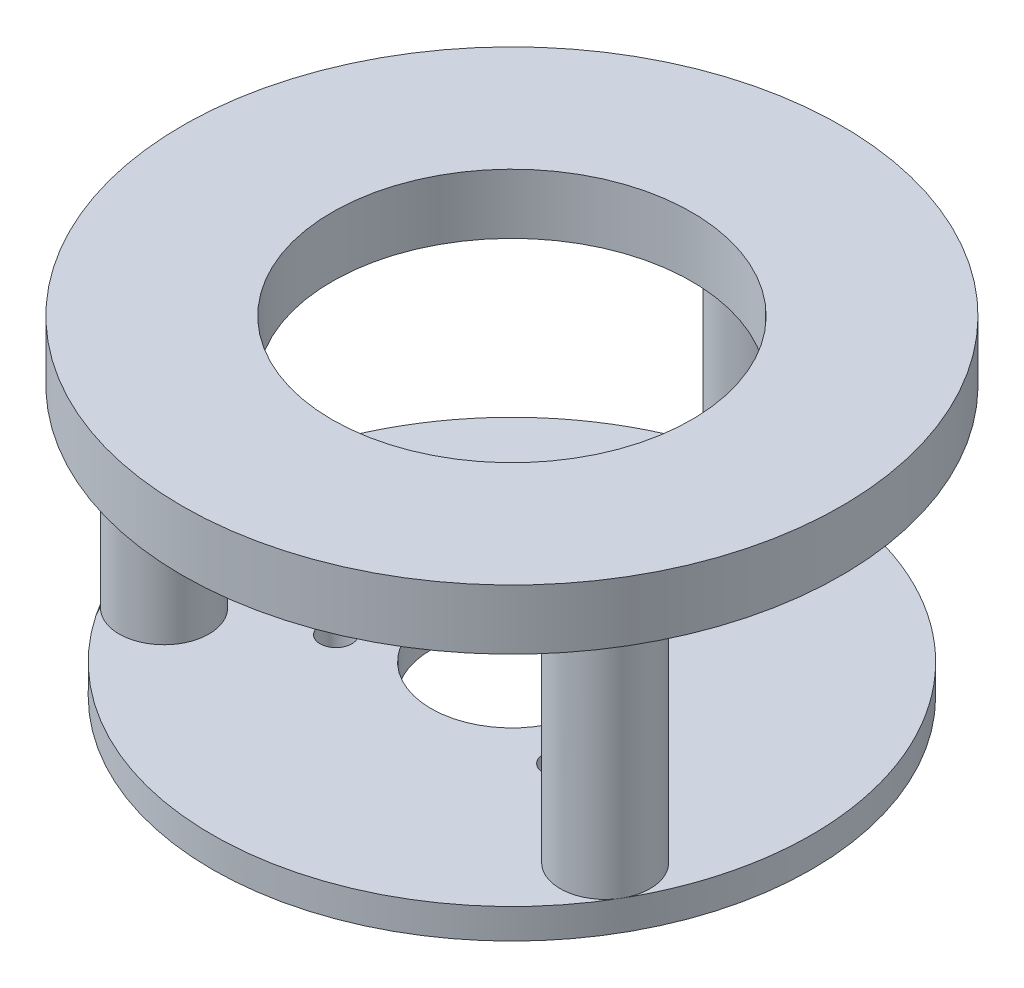
ISO-10303-21;
HEADER;
FILE_DESCRIPTION(('STEP AP214'),'2;1');
FILE_NAME('part.step','',(''),(''),'','','');
FILE_SCHEMA(('AUTOMOTIVE_DESIGN { 1 0 10303 214 1 1 1 1 }'));
ENDSEC;
DATA;
#1=APPLICATION_CONTEXT('core data for automotive mechanical design processes');
#2=APPLICATION_PROTOCOL_DEFINITION('international standard','automotive_design',2000,#1);
#3=PRODUCT_CONTEXT('',#1,'mechanical');
#4=PRODUCT('Part','Part','',(#3));
#5=PRODUCT_RELATED_PRODUCT_CATEGORY('part','',(#4));
#6=PRODUCT_DEFINITION_FORMATION('','',#4);
#7=PRODUCT_DEFINITION_CONTEXT('part definition',#1,'design');
#8=PRODUCT_DEFINITION('design','',#6,#7);
#9=PRODUCT_DEFINITION_SHAPE('','',#8);
#10=(LENGTH_UNIT() NAMED_UNIT(*) SI_UNIT(.MILLI.,.METRE.));
#11=(NAMED_UNIT(*) PLANE_ANGLE_UNIT() SI_UNIT($,.RADIAN.));
#12=(NAMED_UNIT(*) SI_UNIT($,.STERADIAN.) SOLID_ANGLE_UNIT());
#13=UNCERTAINTY_MEASURE_WITH_UNIT(LENGTH_MEASURE(1.E-05),#10,'distance_accuracy_value','');
#14=(GEOMETRIC_REPRESENTATION_CONTEXT(3) GLOBAL_UNCERTAINTY_ASSIGNED_CONTEXT((#13)) GLOBAL_UNIT_ASSIGNED_CONTEXT((#10,
#11,#12)) REPRESENTATION_CONTEXT('',''));
#15=CARTESIAN_POINT('',(0.,0.,0.));
#16=DIRECTION('',(0.,0.,1.));
#17=DIRECTION('',(1.,0.,0.));
#18=AXIS2_PLACEMENT_3D('',#15,#16,#17);
#19=CARTESIAN_POINT('',(23.0125,5.,0.));
#20=DIRECTION('',(0.,-1.,0.));
#21=DIRECTION('',(0.,0.,-1.));
#22=AXIS2_PLACEMENT_3D('',#19,#20,#21);
#23=CYLINDRICAL_SURFACE('',#22,1.65);
#24=CARTESIAN_POINT('',(23.0125,5.,0.));
#25=DIRECTION('',(0.,1.,0.));
#26=DIRECTION('',(0.,0.,1.));
#27=AXIS2_PLACEMENT_3D('',#24,#25,#26);
#28=CIRCLE('',#27,1.65);
#29=CARTESIAN_POINT('',(23.0125,5.,1.65));
#30=VERTEX_POINT('',#29);
#31=EDGE_CURVE('E336',#30,#30,#28,.T.);
#32=ORIENTED_EDGE('',*,*,#31,.T.);
#33=EDGE_LOOP('',(#32));
#34=FACE_BOUND('',#33,.T.);
#35=CARTESIAN_POINT('',(23.0125,3.5,0.));
#36=DIRECTION('',(0.,-1.,0.));
#37=DIRECTION('',(0.,0.,-1.));
#38=AXIS2_PLACEMENT_3D('',#35,#36,#37);
#39=CIRCLE('',#38,1.65);
#40=CARTESIAN_POINT('',(23.0125,3.5,-1.65));
#41=VERTEX_POINT('',#40);
#42=EDGE_CURVE('E42',#41,#41,#39,.T.);
#43=ORIENTED_EDGE('',*,*,#42,.T.);
#44=EDGE_LOOP('',(#43));
#45=FACE_BOUND('',#44,.T.);
#46=ADVANCED_FACE('F38',(#34,#45),#23,.F.);
#47=CARTESIAN_POINT('',(-23.0125,5.,-1.60031132328928E-13));
#48=DIRECTION('',(0.,-1.,0.));
#49=DIRECTION('',(0.,0.,-1.));
#50=AXIS2_PLACEMENT_3D('',#47,#48,#49);
#51=CYLINDRICAL_SURFACE('',#50,1.65);
#52=CARTESIAN_POINT('',(-23.0125,5.,-1.60031132328928E-13));
#53=DIRECTION('',(0.,1.,0.));
#54=DIRECTION('',(0.,0.,1.));
#55=AXIS2_PLACEMENT_3D('',#52,#53,#54);
#56=CIRCLE('',#55,1.65);
#57=CARTESIAN_POINT('',(-23.0125,5.,1.64999999999984));
#58=VERTEX_POINT('',#57);
#59=EDGE_CURVE('E329',#58,#58,#56,.T.);
#60=ORIENTED_EDGE('',*,*,#59,.T.);
#61=EDGE_LOOP('',(#60));
#62=FACE_BOUND('',#61,.T.);
#63=CARTESIAN_POINT('',(-23.0125,3.5,-1.60031132328928E-13));
#64=DIRECTION('',(0.,-1.,0.));
#65=DIRECTION('',(0.,0.,-1.));
#66=AXIS2_PLACEMENT_3D('',#63,#64,#65);
#67=CIRCLE('',#66,1.65);
#68=CARTESIAN_POINT('',(-23.0125,3.5,-1.65000000000016));
#69=VERTEX_POINT('',#68);
#70=EDGE_CURVE('E202',#69,#69,#67,.T.);
#71=ORIENTED_EDGE('',*,*,#70,.T.);
#72=EDGE_LOOP('',(#71));
#73=FACE_BOUND('',#72,.T.);
#74=ADVANCED_FACE('F377',(#62,#73),#51,.F.);
#75=CARTESIAN_POINT('',(0.,5.,0.));
#76=DIRECTION('',(0.,1.,0.));
#77=DIRECTION('',(0.,0.,1.));
#78=AXIS2_PLACEMENT_3D('',#75,#76,#77);
#79=PLANE('',#78);
#80=CARTESIAN_POINT('',(18.6195461813668,5.,10.7499999999992));
#81=DIRECTION('',(0.,1.,0.));
#82=DIRECTION('',(0.,0.,1.));
#83=AXIS2_PLACEMENT_3D('',#80,#81,#82);
#84=CIRCLE('',#83,2.65);
#85=CARTESIAN_POINT('',(18.6195461813668,5.,13.3999999999992));
#86=VERTEX_POINT('',#85);
#87=EDGE_CURVE('E325',#86,#86,#84,.T.);
#88=ORIENTED_EDGE('',*,*,#87,.F.);
#89=EDGE_LOOP('',(#88));
#90=FACE_BOUND('',#89,.T.);
#91=ORIENTED_EDGE('',*,*,#31,.F.);
#92=EDGE_LOOP('',(#91));
#93=FACE_BOUND('',#92,.T.);
#94=CARTESIAN_POINT('',(0.,5.,0.));
#95=DIRECTION('',(0.,1.,0.));
#96=DIRECTION('',(0.,0.,1.));
#97=AXIS2_PLACEMENT_3D('',#94,#95,#96);
#98=CIRCLE('',#97,13.5);
#99=CARTESIAN_POINT('',(0.,5.,13.5));
#100=VERTEX_POINT('',#99);
#101=EDGE_CURVE('E349',#100,#100,#98,.T.);
#102=ORIENTED_EDGE('',*,*,#101,.F.);
#103=EDGE_LOOP('',(#102));
#104=FACE_BOUND('',#103,.T.);
#105=CARTESIAN_POINT('',(0.,5.,0.));
#106=DIRECTION('',(0.,1.,0.));
#107=DIRECTION('',(0.,0.,1.));
#108=AXIS2_PLACEMENT_3D('',#105,#106,#107);
#109=CIRCLE('',#108,50.);
#110=CARTESIAN_POINT('',(0.,5.,-50.));
#111=VERTEX_POINT('',#110);
#112=CARTESIAN_POINT('',(-43.3012701892198,5.,25.0000000000037));
#113=VERTEX_POINT('',#112);
#114=EDGE_CURVE('E11',#111,#113,#109,.T.);
#115=ORIENTED_EDGE('',*,*,#114,.T.);
#116=CARTESIAN_POINT('',(-36.806079660835,5.,21.2500000000021));
#117=DIRECTION('',(0.,1.,0.));
#118=DIRECTION('',(0.,0.,1.));
#119=AXIS2_PLACEMENT_3D('',#116,#117,#118);
#120=CIRCLE('',#119,7.50000000000531);
#121=EDGE_CURVE('E290',#113,#113,#120,.T.);
#122=ORIENTED_EDGE('',*,*,#121,.F.);
#123=CARTESIAN_POINT('',(43.3012701892241,5.,24.9999999999963));
#124=VERTEX_POINT('',#123);
#125=EDGE_CURVE('E48',#113,#124,#109,.T.);
#126=ORIENTED_EDGE('',*,*,#125,.T.);
#127=CARTESIAN_POINT('',(36.8060796608423,5.,21.2499999999979));
#128=DIRECTION('',(0.,1.,0.));
#129=DIRECTION('',(0.,0.,1.));
#130=AXIS2_PLACEMENT_3D('',#127,#128,#129);
#131=CIRCLE('',#130,7.50000000000376);
#132=EDGE_CURVE('E298',#124,#124,#131,.T.);
#133=ORIENTED_EDGE('',*,*,#132,.F.);
#134=EDGE_CURVE('E50',#124,#111,#109,.T.);
#135=ORIENTED_EDGE('',*,*,#134,.T.);
#136=CARTESIAN_POINT('',(0.,5.,-42.5));
#137=DIRECTION('',(0.,1.,0.));
#138=DIRECTION('',(0.,0.,1.));
#139=AXIS2_PLACEMENT_3D('',#136,#137,#138);
#140=CIRCLE('',#139,7.5);
#141=EDGE_CURVE('E305',#111,#111,#140,.T.);
#142=ORIENTED_EDGE('',*,*,#141,.F.);
#143=EDGE_LOOP('',(#115,#122,#126,#133,#135,#142));
#144=FACE_BOUND('',#143,.T.);
#145=CARTESIAN_POINT('',(0.,5.,-21.5));
#146=DIRECTION('',(0.,1.,0.));
#147=DIRECTION('',(0.,0.,1.));
#148=AXIS2_PLACEMENT_3D('',#145,#146,#147);
#149=CIRCLE('',#148,2.65);
#150=CARTESIAN_POINT('',(0.,5.,-18.85));
#151=VERTEX_POINT('',#150);
#152=EDGE_CURVE('E341',#151,#151,#149,.T.);
#153=ORIENTED_EDGE('',*,*,#152,.F.);
#154=EDGE_LOOP('',(#153));
#155=FACE_BOUND('',#154,.T.);
#156=ORIENTED_EDGE('',*,*,#59,.F.);
#157=EDGE_LOOP('',(#156));
#158=FACE_BOUND('',#157,.T.);
#159=CARTESIAN_POINT('',(-18.6195461813641,5.,10.7500000000008));
#160=DIRECTION('',(0.,1.,0.));
#161=DIRECTION('',(0.,0.,1.));
#162=AXIS2_PLACEMENT_3D('',#159,#160,#161);
#163=CIRCLE('',#162,2.65);
#164=CARTESIAN_POINT('',(-18.6195461813641,5.,13.4000000000008));
#165=VERTEX_POINT('',#164);
#166=EDGE_CURVE('E317',#165,#165,#163,.T.);
#167=ORIENTED_EDGE('',*,*,#166,.F.);
#168=EDGE_LOOP('',(#167));
#169=FACE_BOUND('',#168,.T.);
#170=ADVANCED_FACE('F384',(#90,#93,#104,#144,#155,#158,#169),#79,.T.);
#171=CARTESIAN_POINT('',(0.,0.,0.));
#172=DIRECTION('',(0.,1.,0.));
#173=DIRECTION('',(0.,0.,1.));
#174=AXIS2_PLACEMENT_3D('',#171,#172,#173);
#175=PLANE('',#174);
#176=DIRECTION('',(-0.499999999999994,0.,0.866025403784442));
#177=VECTOR('',#176,1.);
#178=CARTESIAN_POINT('',(26.4766016151378,0.,0.));
#179=LINE('',#178,#177);
#180=CARTESIAN_POINT('',(26.4766016151378,0.,0.));
#181=VERTEX_POINT('',#180);
#182=CARTESIAN_POINT('',(24.7445508075689,0.,2.99999999999999));
#183=VERTEX_POINT('',#182);
#184=EDGE_CURVE('E184',#181,#183,#179,.T.);
#185=ORIENTED_EDGE('',*,*,#184,.F.);
#186=DIRECTION('',(0.500000000000006,0.,0.866025403784435));
#187=VECTOR('',#186,1.);
#188=CARTESIAN_POINT('',(24.7445508075689,0.,-3.00000000000002));
#189=LINE('',#188,#187);
#190=CARTESIAN_POINT('',(24.7445508075689,0.,-3.00000000000002));
#191=VERTEX_POINT('',#190);
#192=EDGE_CURVE('E57',#191,#181,#189,.T.);
#193=ORIENTED_EDGE('',*,*,#192,.F.);
#194=DIRECTION('',(1.,0.,0.));
#195=VECTOR('',#194,1.);
#196=CARTESIAN_POINT('',(21.2804491924311,0.,-2.99999999999999));
#197=LINE('',#196,#195);
#198=CARTESIAN_POINT('',(21.2804491924311,0.,-2.99999999999999));
#199=VERTEX_POINT('',#198);
#200=EDGE_CURVE('E164',#199,#191,#197,.T.);
#201=ORIENTED_EDGE('',*,*,#200,.F.);
#202=DIRECTION('',(0.499999999999994,0.,-0.866025403784442));
#203=VECTOR('',#202,1.);
#204=CARTESIAN_POINT('',(19.5483983848622,0.,0.));
#205=LINE('',#204,#203);
#206=CARTESIAN_POINT('',(19.5483983848622,0.,0.));
#207=VERTEX_POINT('',#206);
#208=EDGE_CURVE('E168',#207,#199,#205,.T.);
#209=ORIENTED_EDGE('',*,*,#208,.F.);
#210=DIRECTION('',(-0.500000000000006,0.,-0.866025403784435));
#211=VECTOR('',#210,1.);
#212=CARTESIAN_POINT('',(21.2804491924311,0.,3.00000000000001));
#213=LINE('',#212,#211);
#214=CARTESIAN_POINT('',(21.2804491924311,0.,3.00000000000001));
#215=VERTEX_POINT('',#214);
#216=EDGE_CURVE('E192',#215,#207,#213,.T.);
#217=ORIENTED_EDGE('',*,*,#216,.F.);
#218=DIRECTION('',(-1.,0.,0.));
#219=VECTOR('',#218,1.);
#220=CARTESIAN_POINT('',(24.7445508075689,0.,2.99999999999999));
#221=LINE('',#220,#219);
#222=EDGE_CURVE('E188',#183,#215,#221,.T.);
#223=ORIENTED_EDGE('',*,*,#222,.F.);
#224=EDGE_LOOP('',(#185,#193,#201,#209,#217,#223));
#225=FACE_BOUND('',#224,.T.);
#226=DIRECTION('',(0.5,0.,-0.866025403784439));
#227=VECTOR('',#226,1.);
#228=CARTESIAN_POINT('',(-26.4766016151378,0.,-1.6089927076859E-13));
#229=LINE('',#228,#227);
#230=CARTESIAN_POINT('',(-26.4766016151378,0.,-1.61329283265843E-13));
#231=VERTEX_POINT('',#230);
#232=CARTESIAN_POINT('',(-24.7445508075689,0.,-3.00000000000016));
#233=VERTEX_POINT('',#232);
#234=EDGE_CURVE('E242',#231,#233,#229,.T.);
#235=ORIENTED_EDGE('',*,*,#234,.F.);
#236=DIRECTION('',(-0.5,0.,-0.866025403784439));
#237=VECTOR('',#236,1.);
#238=CARTESIAN_POINT('',(-24.7445508075689,0.,2.99999999999984));
#239=LINE('',#238,#237);
#240=CARTESIAN_POINT('',(-24.7445508075689,0.,2.99999999999984));
#241=VERTEX_POINT('',#240);
#242=EDGE_CURVE('E65',#241,#231,#239,.T.);
#243=ORIENTED_EDGE('',*,*,#242,.F.);
#244=DIRECTION('',(-1.,0.,0.));
#245=VECTOR('',#244,1.);
#246=CARTESIAN_POINT('',(-21.2804491924311,0.,2.99999999999984));
#247=LINE('',#246,#245);
#248=CARTESIAN_POINT('',(-21.2804491924311,0.,2.99999999999984));
#249=VERTEX_POINT('',#248);
#250=EDGE_CURVE('E219',#249,#241,#247,.T.);
#251=ORIENTED_EDGE('',*,*,#250,.F.);
#252=DIRECTION('',(-0.5,0.,0.866025403784439));
#253=VECTOR('',#252,1.);
#254=CARTESIAN_POINT('',(-19.5483983848622,0.,-1.58522007866661E-13));
#255=LINE('',#254,#253);
#256=CARTESIAN_POINT('',(-19.5483983848622,0.,-1.58522007866661E-13));
#257=VERTEX_POINT('',#256);
#258=EDGE_CURVE('E254',#257,#249,#255,.T.);
#259=ORIENTED_EDGE('',*,*,#258,.F.);
#260=DIRECTION('',(0.5,0.,0.866025403784438));
#261=VECTOR('',#260,1.);
#262=CARTESIAN_POINT('',(-21.2804491924311,0.,-3.00000000000016));
#263=LINE('',#262,#261);
#264=CARTESIAN_POINT('',(-21.2804491924311,0.,-3.00000000000016));
#265=VERTEX_POINT('',#264);
#266=EDGE_CURVE('E250',#265,#257,#263,.T.);
#267=ORIENTED_EDGE('',*,*,#266,.F.);
#268=DIRECTION('',(1.,0.,0.));
#269=VECTOR('',#268,1.);
#270=CARTESIAN_POINT('',(-24.7445508075689,0.,-3.00000000000016));
#271=LINE('',#270,#269);
#272=EDGE_CURVE('E246',#233,#265,#271,.T.);
#273=ORIENTED_EDGE('',*,*,#272,.F.);
#274=EDGE_LOOP('',(#235,#243,#251,#259,#267,#273));
#275=FACE_BOUND('',#274,.T.);
#276=CARTESIAN_POINT('',(0.,0.,0.));
#277=DIRECTION('',(0.,1.,0.));
#278=DIRECTION('',(0.,0.,1.));
#279=AXIS2_PLACEMENT_3D('',#276,#277,#278);
#280=CIRCLE('',#279,50.);
#281=CARTESIAN_POINT('',(0.,0.,50.));
#282=VERTEX_POINT('',#281);
#283=EDGE_CURVE('E353',#282,#282,#280,.T.);
#284=ORIENTED_EDGE('',*,*,#283,.F.);
#285=EDGE_LOOP('',(#284));
#286=FACE_BOUND('',#285,.T.);
#287=CARTESIAN_POINT('',(0.,0.,0.));
#288=DIRECTION('',(0.,1.,0.));
#289=DIRECTION('',(0.,0.,1.));
#290=AXIS2_PLACEMENT_3D('',#287,#288,#289);
#291=CIRCLE('',#290,13.5);
#292=CARTESIAN_POINT('',(0.,0.,13.5));
#293=VERTEX_POINT('',#292);
#294=EDGE_CURVE('E345',#293,#293,#291,.T.);
#295=ORIENTED_EDGE('',*,*,#294,.T.);
#296=EDGE_LOOP('',(#295));
#297=FACE_BOUND('',#296,.T.);
#298=CARTESIAN_POINT('',(0.,0.,-21.5));
#299=DIRECTION('',(0.,1.,0.));
#300=DIRECTION('',(0.,0.,1.));
#301=AXIS2_PLACEMENT_3D('',#298,#299,#300);
#302=CIRCLE('',#301,2.65);
#303=CARTESIAN_POINT('',(0.,0.,-18.85));
#304=VERTEX_POINT('',#303);
#305=EDGE_CURVE('E340',#304,#304,#302,.T.);
#306=ORIENTED_EDGE('',*,*,#305,.T.);
#307=EDGE_LOOP('',(#306));
#308=FACE_BOUND('',#307,.T.);
#309=CARTESIAN_POINT('',(18.6195461813668,0.,10.7499999999992));
#310=DIRECTION('',(0.,1.,0.));
#311=DIRECTION('',(0.,0.,1.));
#312=AXIS2_PLACEMENT_3D('',#309,#310,#311);
#313=CIRCLE('',#312,2.65);
#314=CARTESIAN_POINT('',(18.6195461813668,0.,13.3999999999992));
#315=VERTEX_POINT('',#314);
#316=EDGE_CURVE('E321',#315,#315,#313,.T.);
#317=ORIENTED_EDGE('',*,*,#316,.T.);
#318=EDGE_LOOP('',(#317));
#319=FACE_BOUND('',#318,.T.);
#320=CARTESIAN_POINT('',(-18.6195461813641,0.,10.7500000000008));
#321=DIRECTION('',(0.,1.,0.));
#322=DIRECTION('',(0.,0.,1.));
#323=AXIS2_PLACEMENT_3D('',#320,#321,#322);
#324=CIRCLE('',#323,2.65);
#325=CARTESIAN_POINT('',(-18.6195461813641,0.,13.4000000000008));
#326=VERTEX_POINT('',#325);
#327=EDGE_CURVE('E313',#326,#326,#324,.T.);
#328=ORIENTED_EDGE('',*,*,#327,.T.);
#329=EDGE_LOOP('',(#328));
#330=FACE_BOUND('',#329,.T.);
#331=ADVANCED_FACE('F399',(#225,#275,#286,#297,#308,#319,#330),#175,.F.);
#332=CARTESIAN_POINT('',(0.,5.,0.));
#333=DIRECTION('',(0.,-1.,0.));
#334=DIRECTION('',(0.,0.,-1.));
#335=AXIS2_PLACEMENT_3D('',#332,#333,#334);
#336=CYLINDRICAL_SURFACE('',#335,50.);
#337=ORIENTED_EDGE('',*,*,#114,.F.);
#338=ORIENTED_EDGE('',*,*,#134,.F.);
#339=ORIENTED_EDGE('',*,*,#125,.F.);
#340=EDGE_LOOP('',(#337,#338,#339));
#341=FACE_BOUND('',#340,.T.);
#342=ORIENTED_EDGE('',*,*,#283,.T.);
#343=EDGE_LOOP('',(#342));
#344=FACE_BOUND('',#343,.T.);
#345=ADVANCED_FACE('F40',(#341,#344),#336,.T.);
#346=CARTESIAN_POINT('',(0.,5.,0.));
#347=DIRECTION('',(0.,-1.,0.));
#348=DIRECTION('',(0.,0.,-1.));
#349=AXIS2_PLACEMENT_3D('',#346,#347,#348);
#350=CYLINDRICAL_SURFACE('',#349,13.5);
#351=ORIENTED_EDGE('',*,*,#101,.T.);
#352=EDGE_LOOP('',(#351));
#353=FACE_BOUND('',#352,.T.);
#354=ORIENTED_EDGE('',*,*,#294,.F.);
#355=EDGE_LOOP('',(#354));
#356=FACE_BOUND('',#355,.T.);
#357=ADVANCED_FACE('F393',(#353,#356),#350,.F.);
#358=CARTESIAN_POINT('',(0.,5.,-21.5));
#359=DIRECTION('',(0.,-1.,0.));
#360=DIRECTION('',(0.,0.,-1.));
#361=AXIS2_PLACEMENT_3D('',#358,#359,#360);
#362=CYLINDRICAL_SURFACE('',#361,2.65);
#363=ORIENTED_EDGE('',*,*,#152,.T.);
#364=EDGE_LOOP('',(#363));
#365=FACE_BOUND('',#364,.T.);
#366=ORIENTED_EDGE('',*,*,#305,.F.);
#367=EDGE_LOOP('',(#366));
#368=FACE_BOUND('',#367,.T.);
#369=ADVANCED_FACE('F389',(#365,#368),#362,.F.);
#370=CARTESIAN_POINT('',(18.6195461813668,5.,10.7499999999992));
#371=DIRECTION('',(0.,-1.,0.));
#372=DIRECTION('',(0.,0.,-1.));
#373=AXIS2_PLACEMENT_3D('',#370,#371,#372);
#374=CYLINDRICAL_SURFACE('',#373,2.65);
#375=ORIENTED_EDGE('',*,*,#87,.T.);
#376=EDGE_LOOP('',(#375));
#377=FACE_BOUND('',#376,.T.);
#378=ORIENTED_EDGE('',*,*,#316,.F.);
#379=EDGE_LOOP('',(#378));
#380=FACE_BOUND('',#379,.T.);
#381=ADVANCED_FACE('F392',(#377,#380),#374,.F.);
#382=CARTESIAN_POINT('',(-18.6195461813641,5.,10.7500000000008));
#383=DIRECTION('',(0.,-1.,0.));
#384=DIRECTION('',(0.,0.,-1.));
#385=AXIS2_PLACEMENT_3D('',#382,#383,#384);
#386=CYLINDRICAL_SURFACE('',#385,2.65);
#387=ORIENTED_EDGE('',*,*,#166,.T.);
#388=EDGE_LOOP('',(#387));
#389=FACE_BOUND('',#388,.T.);
#390=ORIENTED_EDGE('',*,*,#327,.F.);
#391=EDGE_LOOP('',(#390));
#392=FACE_BOUND('',#391,.T.);
#393=ADVANCED_FACE('F423',(#389,#392),#386,.F.);
#394=CARTESIAN_POINT('',(0.,45.,-42.5));
#395=DIRECTION('',(0.,-1.,0.));
#396=DIRECTION('',(0.,0.,-1.));
#397=AXIS2_PLACEMENT_3D('',#394,#395,#396);
#398=CYLINDRICAL_SURFACE('',#397,7.5);
#399=CARTESIAN_POINT('',(0.,45.,-42.5));
#400=DIRECTION('',(0.,1.,0.));
#401=DIRECTION('',(0.,0.,1.));
#402=AXIS2_PLACEMENT_3D('',#399,#400,#401);
#403=CIRCLE('',#402,7.5);
#404=CARTESIAN_POINT('',(0.,45.,-35.));
#405=VERTEX_POINT('',#404);
#406=EDGE_CURVE('E309',#405,#405,#403,.T.);
#407=ORIENTED_EDGE('',*,*,#406,.F.);
#408=EDGE_LOOP('',(#407));
#409=FACE_BOUND('',#408,.T.);
#410=ORIENTED_EDGE('',*,*,#141,.T.);
#411=EDGE_LOOP('',(#410));
#412=FACE_BOUND('',#411,.T.);
#413=ADVANCED_FACE('F425',(#409,#412),#398,.T.);
#414=CARTESIAN_POINT('',(36.8060796608423,45.,21.2499999999979));
#415=DIRECTION('',(0.,-1.,0.));
#416=DIRECTION('',(0.,0.,-1.));
#417=AXIS2_PLACEMENT_3D('',#414,#415,#416);
#418=CYLINDRICAL_SURFACE('',#417,7.50000000000376);
#419=CARTESIAN_POINT('',(36.8060796608423,45.,21.2499999999979));
#420=DIRECTION('',(0.,1.,0.));
#421=DIRECTION('',(0.,0.,1.));
#422=AXIS2_PLACEMENT_3D('',#419,#420,#421);
#423=CIRCLE('',#422,7.50000000000376);
#424=CARTESIAN_POINT('',(36.8060796608423,45.,28.7500000000017));
#425=VERTEX_POINT('',#424);
#426=EDGE_CURVE('E301',#425,#425,#423,.T.);
#427=ORIENTED_EDGE('',*,*,#426,.F.);
#428=EDGE_LOOP('',(#427));
#429=FACE_BOUND('',#428,.T.);
#430=ORIENTED_EDGE('',*,*,#132,.T.);
#431=EDGE_LOOP('',(#430));
#432=FACE_BOUND('',#431,.T.);
#433=ADVANCED_FACE('F432',(#429,#432),#418,.T.);
#434=CARTESIAN_POINT('',(-36.806079660835,45.,21.2500000000021));
#435=DIRECTION('',(0.,-1.,0.));
#436=DIRECTION('',(0.,0.,-1.));
#437=AXIS2_PLACEMENT_3D('',#434,#435,#436);
#438=CYLINDRICAL_SURFACE('',#437,7.50000000000531);
#439=CARTESIAN_POINT('',(-36.806079660835,45.,21.2500000000021));
#440=DIRECTION('',(0.,1.,0.));
#441=DIRECTION('',(0.,0.,1.));
#442=AXIS2_PLACEMENT_3D('',#439,#440,#441);
#443=CIRCLE('',#442,7.50000000000531);
#444=CARTESIAN_POINT('',(-36.806079660835,45.,28.7500000000074));
#445=VERTEX_POINT('',#444);
#446=EDGE_CURVE('E294',#445,#445,#443,.T.);
#447=ORIENTED_EDGE('',*,*,#446,.F.);
#448=EDGE_LOOP('',(#447));
#449=FACE_BOUND('',#448,.T.);
#450=ORIENTED_EDGE('',*,*,#121,.T.);
#451=EDGE_LOOP('',(#450));
#452=FACE_BOUND('',#451,.T.);
#453=ADVANCED_FACE('F439',(#449,#452),#438,.T.);
#454=CARTESIAN_POINT('',(0.,55.,0.));
#455=DIRECTION('',(0.,1.,0.));
#456=DIRECTION('',(0.,0.,1.));
#457=AXIS2_PLACEMENT_3D('',#454,#455,#456);
#458=PLANE('',#457);
#459=CARTESIAN_POINT('',(0.,55.,0.));
#460=DIRECTION('',(0.,1.,0.));
#461=DIRECTION('',(0.,0.,1.));
#462=AXIS2_PLACEMENT_3D('',#459,#460,#461);
#463=CIRCLE('',#462,55.);
#464=CARTESIAN_POINT('',(0.,55.,55.));
#465=VERTEX_POINT('',#464);
#466=EDGE_CURVE('E286',#465,#465,#463,.T.);
#467=ORIENTED_EDGE('',*,*,#466,.T.);
#468=EDGE_LOOP('',(#467));
#469=FACE_BOUND('',#468,.T.);
#470=CARTESIAN_POINT('',(0.,55.,0.));
#471=DIRECTION('',(0.,1.,0.));
#472=DIRECTION('',(0.,0.,1.));
#473=AXIS2_PLACEMENT_3D('',#470,#471,#472);
#474=CIRCLE('',#473,30.);
#475=CARTESIAN_POINT('',(0.,55.,30.));
#476=VERTEX_POINT('',#475);
#477=EDGE_CURVE('E277',#476,#476,#474,.T.);
#478=ORIENTED_EDGE('',*,*,#477,.F.);
#479=EDGE_LOOP('',(#478));
#480=FACE_BOUND('',#479,.T.);
#481=ADVANCED_FACE('F443',(#469,#480),#458,.T.);
#482=CARTESIAN_POINT('',(0.,45.,0.));
#483=DIRECTION('',(0.,1.,0.));
#484=DIRECTION('',(0.,0.,1.));
#485=AXIS2_PLACEMENT_3D('',#482,#483,#484);
#486=PLANE('',#485);
#487=ORIENTED_EDGE('',*,*,#406,.T.);
#488=EDGE_LOOP('',(#487));
#489=FACE_BOUND('',#488,.T.);
#490=ORIENTED_EDGE('',*,*,#426,.T.);
#491=EDGE_LOOP('',(#490));
#492=FACE_BOUND('',#491,.T.);
#493=ORIENTED_EDGE('',*,*,#446,.T.);
#494=EDGE_LOOP('',(#493));
#495=FACE_BOUND('',#494,.T.);
#496=CARTESIAN_POINT('',(0.,45.,0.));
#497=DIRECTION('',(0.,1.,0.));
#498=DIRECTION('',(0.,0.,1.));
#499=AXIS2_PLACEMENT_3D('',#496,#497,#498);
#500=CIRCLE('',#499,55.);
#501=CARTESIAN_POINT('',(0.,45.,55.));
#502=VERTEX_POINT('',#501);
#503=EDGE_CURVE('E281',#502,#502,#500,.T.);
#504=ORIENTED_EDGE('',*,*,#503,.F.);
#505=EDGE_LOOP('',(#504));
#506=FACE_BOUND('',#505,.T.);
#507=CARTESIAN_POINT('',(0.,45.,0.));
#508=DIRECTION('',(0.,1.,0.));
#509=DIRECTION('',(0.,0.,1.));
#510=AXIS2_PLACEMENT_3D('',#507,#508,#509);
#511=CIRCLE('',#510,30.);
#512=CARTESIAN_POINT('',(0.,45.,30.));
#513=VERTEX_POINT('',#512);
#514=EDGE_CURVE('E282',#513,#513,#511,.T.);
#515=ORIENTED_EDGE('',*,*,#514,.T.);
#516=EDGE_LOOP('',(#515));
#517=FACE_BOUND('',#516,.T.);
#518=ADVANCED_FACE('F449',(#489,#492,#495,#506,#517),#486,.F.);
#519=CARTESIAN_POINT('',(0.,55.,0.));
#520=DIRECTION('',(0.,-1.,0.));
#521=DIRECTION('',(0.,0.,-1.));
#522=AXIS2_PLACEMENT_3D('',#519,#520,#521);
#523=CYLINDRICAL_SURFACE('',#522,55.);
#524=ORIENTED_EDGE('',*,*,#466,.F.);
#525=EDGE_LOOP('',(#524));
#526=FACE_BOUND('',#525,.T.);
#527=ORIENTED_EDGE('',*,*,#503,.T.);
#528=EDGE_LOOP('',(#527));
#529=FACE_BOUND('',#528,.T.);
#530=ADVANCED_FACE('F445',(#526,#529),#523,.T.);
#531=CARTESIAN_POINT('',(0.,55.,0.));
#532=DIRECTION('',(0.,-1.,0.));
#533=DIRECTION('',(0.,0.,-1.));
#534=AXIS2_PLACEMENT_3D('',#531,#532,#533);
#535=CYLINDRICAL_SURFACE('',#534,30.);
#536=ORIENTED_EDGE('',*,*,#477,.T.);
#537=EDGE_LOOP('',(#536));
#538=FACE_BOUND('',#537,.T.);
#539=ORIENTED_EDGE('',*,*,#514,.F.);
#540=EDGE_LOOP('',(#539));
#541=FACE_BOUND('',#540,.T.);
#542=ADVANCED_FACE('F448',(#538,#541),#535,.F.);
#543=CARTESIAN_POINT('',(-24.7445508075689,3.5,2.99999999999984));
#544=DIRECTION('',(-0.866025403784439,0.,0.5));
#545=DIRECTION('',(0.5,0.,0.866025403784439));
#546=AXIS2_PLACEMENT_3D('',#543,#544,#545);
#547=PLANE('',#546);
#548=ORIENTED_EDGE('',*,*,#242,.T.);
#549=DIRECTION('',(0.,-1.,0.));
#550=VECTOR('',#549,1.);
#551=CARTESIAN_POINT('',(-26.4766016151378,3.5,-1.6089927076859E-13));
#552=LINE('',#551,#550);
#553=CARTESIAN_POINT('',(-26.4766016151378,3.5,-1.6089927076859E-13));
#554=VERTEX_POINT('',#553);
#555=EDGE_CURVE('E239',#554,#231,#552,.T.);
#556=ORIENTED_EDGE('',*,*,#555,.F.);
#557=DIRECTION('',(-0.5,0.,-0.866025403784439));
#558=VECTOR('',#557,1.);
#559=CARTESIAN_POINT('',(-24.7445508075689,3.5,2.99999999999984));
#560=LINE('',#559,#558);
#561=CARTESIAN_POINT('',(-24.7445508075689,3.5,2.99999999999984));
#562=VERTEX_POINT('',#561);
#563=EDGE_CURVE('E214',#562,#554,#560,.T.);
#564=ORIENTED_EDGE('',*,*,#563,.F.);
#565=DIRECTION('',(0.,-1.,0.));
#566=VECTOR('',#565,1.);
#567=CARTESIAN_POINT('',(-24.7445508075689,3.5,2.99999999999984));
#568=LINE('',#567,#566);
#569=EDGE_CURVE('E185',#562,#241,#568,.T.);
#570=ORIENTED_EDGE('',*,*,#569,.T.);
#571=EDGE_LOOP('',(#548,#556,#564,#570));
#572=FACE_BOUND('',#571,.T.);
#573=ADVANCED_FACE('F459',(#572),#547,.F.);
#574=CARTESIAN_POINT('',(-21.2804491924311,3.5,2.99999999999984));
#575=DIRECTION('',(0.,0.,1.));
#576=DIRECTION('',(1.,0.,0.));
#577=AXIS2_PLACEMENT_3D('',#574,#575,#576);
#578=PLANE('',#577);
#579=ORIENTED_EDGE('',*,*,#250,.T.);
#580=ORIENTED_EDGE('',*,*,#569,.F.);
#581=DIRECTION('',(-1.,0.,0.));
#582=VECTOR('',#581,1.);
#583=CARTESIAN_POINT('',(-21.2804491924311,3.5,2.99999999999984));
#584=LINE('',#583,#582);
#585=CARTESIAN_POINT('',(-21.2804491924311,3.5,2.99999999999984));
#586=VERTEX_POINT('',#585);
#587=EDGE_CURVE('E235',#586,#562,#584,.T.);
#588=ORIENTED_EDGE('',*,*,#587,.F.);
#589=DIRECTION('',(0.,-1.,0.));
#590=VECTOR('',#589,1.);
#591=CARTESIAN_POINT('',(-21.2804491924311,3.5,2.99999999999984));
#592=LINE('',#591,#590);
#593=EDGE_CURVE('E263',#586,#249,#592,.T.);
#594=ORIENTED_EDGE('',*,*,#593,.T.);
#595=EDGE_LOOP('',(#579,#580,#588,#594));
#596=FACE_BOUND('',#595,.T.);
#597=ADVANCED_FACE('F463',(#596),#578,.F.);
#598=CARTESIAN_POINT('',(-19.5483983848622,3.5,-1.58522007866661E-13));
#599=DIRECTION('',(0.866025403784439,0.,0.5));
#600=DIRECTION('',(0.5,0.,-0.866025403784439));
#601=AXIS2_PLACEMENT_3D('',#598,#599,#600);
#602=PLANE('',#601);
#603=ORIENTED_EDGE('',*,*,#258,.T.);
#604=ORIENTED_EDGE('',*,*,#593,.F.);
#605=DIRECTION('',(-0.5,0.,0.866025403784439));
#606=VECTOR('',#605,1.);
#607=CARTESIAN_POINT('',(-19.5483983848622,3.5,-1.58522007866661E-13));
#608=LINE('',#607,#606);
#609=CARTESIAN_POINT('',(-19.5483983848622,3.5,-1.58522007866661E-13));
#610=VERTEX_POINT('',#609);
#611=EDGE_CURVE('E231',#610,#586,#608,.T.);
#612=ORIENTED_EDGE('',*,*,#611,.F.);
#613=DIRECTION('',(0.,-1.,0.));
#614=VECTOR('',#613,1.);
#615=CARTESIAN_POINT('',(-19.5483983848622,3.5,-1.58522007866661E-13));
#616=LINE('',#615,#614);
#617=EDGE_CURVE('E266',#610,#257,#616,.T.);
#618=ORIENTED_EDGE('',*,*,#617,.T.);
#619=EDGE_LOOP('',(#603,#604,#612,#618));
#620=FACE_BOUND('',#619,.T.);
#621=ADVANCED_FACE('F476',(#620),#602,.F.);
#622=CARTESIAN_POINT('',(-21.2804491924311,3.5,-3.00000000000016));
#623=DIRECTION('',(0.866025403784438,0.,-0.5));
#624=DIRECTION('',(-0.5,0.,-0.866025403784438));
#625=AXIS2_PLACEMENT_3D('',#622,#623,#624);
#626=PLANE('',#625);
#627=ORIENTED_EDGE('',*,*,#266,.T.);
#628=ORIENTED_EDGE('',*,*,#617,.F.);
#629=DIRECTION('',(0.5,0.,0.866025403784438));
#630=VECTOR('',#629,1.);
#631=CARTESIAN_POINT('',(-21.2804491924311,3.5,-3.00000000000016));
#632=LINE('',#631,#630);
#633=CARTESIAN_POINT('',(-21.2804491924311,3.5,-3.00000000000016));
#634=VERTEX_POINT('',#633);
#635=EDGE_CURVE('E227',#634,#610,#632,.T.);
#636=ORIENTED_EDGE('',*,*,#635,.F.);
#637=DIRECTION('',(0.,-1.,0.));
#638=VECTOR('',#637,1.);
#639=CARTESIAN_POINT('',(-21.2804491924311,3.5,-3.00000000000016));
#640=LINE('',#639,#638);
#641=EDGE_CURVE('E269',#634,#265,#640,.T.);
#642=ORIENTED_EDGE('',*,*,#641,.T.);
#643=EDGE_LOOP('',(#627,#628,#636,#642));
#644=FACE_BOUND('',#643,.T.);
#645=ADVANCED_FACE('F472',(#644),#626,.F.);
#646=CARTESIAN_POINT('',(-24.7445508075689,3.5,-3.00000000000016));
#647=DIRECTION('',(0.,0.,-1.));
#648=DIRECTION('',(-1.,0.,0.));
#649=AXIS2_PLACEMENT_3D('',#646,#647,#648);
#650=PLANE('',#649);
#651=ORIENTED_EDGE('',*,*,#272,.T.);
#652=ORIENTED_EDGE('',*,*,#641,.F.);
#653=DIRECTION('',(1.,0.,0.));
#654=VECTOR('',#653,1.);
#655=CARTESIAN_POINT('',(-24.7445508075689,3.5,-3.00000000000016));
#656=LINE('',#655,#654);
#657=CARTESIAN_POINT('',(-24.7445508075689,3.5,-3.00000000000016));
#658=VERTEX_POINT('',#657);
#659=EDGE_CURVE('E223',#658,#634,#656,.T.);
#660=ORIENTED_EDGE('',*,*,#659,.F.);
#661=DIRECTION('',(0.,-1.,0.));
#662=VECTOR('',#661,1.);
#663=CARTESIAN_POINT('',(-24.7445508075689,3.5,-3.00000000000016));
#664=LINE('',#663,#662);
#665=EDGE_CURVE('E272',#658,#233,#664,.T.);
#666=ORIENTED_EDGE('',*,*,#665,.T.);
#667=EDGE_LOOP('',(#651,#652,#660,#666));
#668=FACE_BOUND('',#667,.T.);
#669=ADVANCED_FACE('F468',(#668),#650,.F.);
#670=CARTESIAN_POINT('',(-26.4766016151378,3.5,-1.6089927076859E-13));
#671=DIRECTION('',(-0.866025403784439,0.,-0.5));
#672=DIRECTION('',(-0.5,0.,0.866025403784439));
#673=AXIS2_PLACEMENT_3D('',#670,#671,#672);
#674=PLANE('',#673);
#675=ORIENTED_EDGE('',*,*,#234,.T.);
#676=ORIENTED_EDGE('',*,*,#665,.F.);
#677=DIRECTION('',(0.5,0.,-0.866025403784439));
#678=VECTOR('',#677,1.);
#679=CARTESIAN_POINT('',(-26.4766016151378,3.5,-1.6089927076859E-13));
#680=LINE('',#679,#678);
#681=EDGE_CURVE('E218',#554,#658,#680,.T.);
#682=ORIENTED_EDGE('',*,*,#681,.F.);
#683=ORIENTED_EDGE('',*,*,#555,.T.);
#684=EDGE_LOOP('',(#675,#676,#682,#683));
#685=FACE_BOUND('',#684,.T.);
#686=ADVANCED_FACE('F464',(#685),#674,.F.);
#687=CARTESIAN_POINT('',(0.,3.5,0.));
#688=DIRECTION('',(0.,-1.,0.));
#689=DIRECTION('',(0.,0.,-1.));
#690=AXIS2_PLACEMENT_3D('',#687,#688,#689);
#691=PLANE('',#690);
#692=ORIENTED_EDGE('',*,*,#70,.F.);
#693=EDGE_LOOP('',(#692));
#694=FACE_BOUND('',#693,.T.);
#695=ORIENTED_EDGE('',*,*,#563,.T.);
#696=ORIENTED_EDGE('',*,*,#681,.T.);
#697=ORIENTED_EDGE('',*,*,#659,.T.);
#698=ORIENTED_EDGE('',*,*,#635,.T.);
#699=ORIENTED_EDGE('',*,*,#611,.T.);
#700=ORIENTED_EDGE('',*,*,#587,.T.);
#701=EDGE_LOOP('',(#695,#696,#697,#698,#699,#700));
#702=FACE_BOUND('',#701,.T.);
#703=ADVANCED_FACE('F467',(#694,#702),#691,.T.);
#704=CARTESIAN_POINT('',(24.7445508075689,3.5,-3.00000000000002));
#705=DIRECTION('',(0.866025403784435,0.,-0.500000000000006));
#706=DIRECTION('',(-0.500000000000006,0.,-0.866025403784435));
#707=AXIS2_PLACEMENT_3D('',#704,#705,#706);
#708=PLANE('',#707);
#709=ORIENTED_EDGE('',*,*,#192,.T.);
#710=DIRECTION('',(0.,-1.,0.));
#711=VECTOR('',#710,1.);
#712=CARTESIAN_POINT('',(26.4766016151378,3.5,0.));
#713=LINE('',#712,#711);
#714=CARTESIAN_POINT('',(26.4766016151378,3.5,0.));
#715=VERTEX_POINT('',#714);
#716=EDGE_CURVE('E138',#715,#181,#713,.T.);
#717=ORIENTED_EDGE('',*,*,#716,.F.);
#718=DIRECTION('',(0.500000000000006,0.,0.866025403784435));
#719=VECTOR('',#718,1.);
#720=CARTESIAN_POINT('',(24.7445508075689,3.5,-3.00000000000002));
#721=LINE('',#720,#719);
#722=CARTESIAN_POINT('',(24.7445508075689,3.5,-3.00000000000002));
#723=VERTEX_POINT('',#722);
#724=EDGE_CURVE('E142',#723,#715,#721,.T.);
#725=ORIENTED_EDGE('',*,*,#724,.F.);
#726=DIRECTION('',(0.,-1.,0.));
#727=VECTOR('',#726,1.);
#728=CARTESIAN_POINT('',(24.7445508075689,3.5,-3.00000000000002));
#729=LINE('',#728,#727);
#730=EDGE_CURVE('E199',#723,#191,#729,.T.);
#731=ORIENTED_EDGE('',*,*,#730,.T.);
#732=EDGE_LOOP('',(#709,#717,#725,#731));
#733=FACE_BOUND('',#732,.T.);
#734=ADVANCED_FACE('F140',(#733),#708,.F.);
#735=CARTESIAN_POINT('',(21.2804491924311,3.5,-2.99999999999999));
#736=DIRECTION('',(0.,0.,-1.));
#737=DIRECTION('',(-1.,0.,0.));
#738=AXIS2_PLACEMENT_3D('',#735,#736,#737);
#739=PLANE('',#738);
#740=ORIENTED_EDGE('',*,*,#200,.T.);
#741=ORIENTED_EDGE('',*,*,#730,.F.);
#742=DIRECTION('',(1.,0.,0.));
#743=VECTOR('',#742,1.);
#744=CARTESIAN_POINT('',(21.2804491924311,3.5,-2.99999999999999));
#745=LINE('',#744,#743);
#746=CARTESIAN_POINT('',(21.2804491924311,3.5,-2.99999999999999));
#747=VERTEX_POINT('',#746);
#748=EDGE_CURVE('E149',#747,#723,#745,.T.);
#749=ORIENTED_EDGE('',*,*,#748,.F.);
#750=DIRECTION('',(0.,-1.,0.));
#751=VECTOR('',#750,1.);
#752=CARTESIAN_POINT('',(21.2804491924311,3.5,-2.99999999999999));
#753=LINE('',#752,#751);
#754=EDGE_CURVE('E203',#747,#199,#753,.T.);
#755=ORIENTED_EDGE('',*,*,#754,.T.);
#756=EDGE_LOOP('',(#740,#741,#749,#755));
#757=FACE_BOUND('',#756,.T.);
#758=ADVANCED_FACE('F488',(#757),#739,.F.);
#759=CARTESIAN_POINT('',(19.5483983848622,3.5,0.));
#760=DIRECTION('',(-0.866025403784442,0.,-0.499999999999994));
#761=DIRECTION('',(-0.499999999999994,0.,0.866025403784442));
#762=AXIS2_PLACEMENT_3D('',#759,#760,#761);
#763=PLANE('',#762);
#764=ORIENTED_EDGE('',*,*,#208,.T.);
#765=ORIENTED_EDGE('',*,*,#754,.F.);
#766=DIRECTION('',(0.499999999999994,0.,-0.866025403784442));
#767=VECTOR('',#766,1.);
#768=CARTESIAN_POINT('',(19.5483983848622,3.5,0.));
#769=LINE('',#768,#767);
#770=CARTESIAN_POINT('',(19.5483983848622,3.5,0.));
#771=VERTEX_POINT('',#770);
#772=EDGE_CURVE('E177',#771,#747,#769,.T.);
#773=ORIENTED_EDGE('',*,*,#772,.F.);
#774=DIRECTION('',(0.,-1.,0.));
#775=VECTOR('',#774,1.);
#776=CARTESIAN_POINT('',(19.5483983848622,3.5,0.));
#777=LINE('',#776,#775);
#778=EDGE_CURVE('E206',#771,#207,#777,.T.);
#779=ORIENTED_EDGE('',*,*,#778,.T.);
#780=EDGE_LOOP('',(#764,#765,#773,#779));
#781=FACE_BOUND('',#780,.T.);
#782=ADVANCED_FACE('F496',(#781),#763,.F.);
#783=CARTESIAN_POINT('',(21.2804491924311,3.5,3.00000000000001));
#784=DIRECTION('',(-0.866025403784435,0.,0.500000000000006));
#785=DIRECTION('',(0.500000000000006,0.,0.866025403784435));
#786=AXIS2_PLACEMENT_3D('',#783,#784,#785);
#787=PLANE('',#786);
#788=ORIENTED_EDGE('',*,*,#216,.T.);
#789=ORIENTED_EDGE('',*,*,#778,.F.);
#790=DIRECTION('',(-0.500000000000006,0.,-0.866025403784435));
#791=VECTOR('',#790,1.);
#792=CARTESIAN_POINT('',(21.2804491924311,3.5,3.00000000000001));
#793=LINE('',#792,#791);
#794=CARTESIAN_POINT('',(21.2804491924311,3.5,3.00000000000001));
#795=VERTEX_POINT('',#794);
#796=EDGE_CURVE('E173',#795,#771,#793,.T.);
#797=ORIENTED_EDGE('',*,*,#796,.F.);
#798=DIRECTION('',(0.,-1.,0.));
#799=VECTOR('',#798,1.);
#800=CARTESIAN_POINT('',(21.2804491924311,3.5,3.00000000000001));
#801=LINE('',#800,#799);
#802=EDGE_CURVE('E209',#795,#215,#801,.T.);
#803=ORIENTED_EDGE('',*,*,#802,.T.);
#804=EDGE_LOOP('',(#788,#789,#797,#803));
#805=FACE_BOUND('',#804,.T.);
#806=ADVANCED_FACE('F492',(#805),#787,.F.);
#807=CARTESIAN_POINT('',(24.7445508075689,3.5,2.99999999999999));
#808=DIRECTION('',(0.,0.,1.));
#809=DIRECTION('',(1.,0.,0.));
#810=AXIS2_PLACEMENT_3D('',#807,#808,#809);
#811=PLANE('',#810);
#812=ORIENTED_EDGE('',*,*,#222,.T.);
#813=ORIENTED_EDGE('',*,*,#802,.F.);
#814=DIRECTION('',(-1.,0.,0.));
#815=VECTOR('',#814,1.);
#816=CARTESIAN_POINT('',(24.7445508075689,3.5,2.99999999999999));
#817=LINE('',#816,#815);
#818=CARTESIAN_POINT('',(24.7445508075689,3.5,2.99999999999999));
#819=VERTEX_POINT('',#818);
#820=EDGE_CURVE('E158',#819,#795,#817,.T.);
#821=ORIENTED_EDGE('',*,*,#820,.F.);
#822=DIRECTION('',(0.,-1.,0.));
#823=VECTOR('',#822,1.);
#824=CARTESIAN_POINT('',(24.7445508075689,3.5,2.99999999999999));
#825=LINE('',#824,#823);
#826=EDGE_CURVE('E148',#819,#183,#825,.T.);
#827=ORIENTED_EDGE('',*,*,#826,.T.);
#828=EDGE_LOOP('',(#812,#813,#821,#827));
#829=FACE_BOUND('',#828,.T.);
#830=ADVANCED_FACE('F373',(#829),#811,.F.);
#831=CARTESIAN_POINT('',(26.4766016151378,3.5,0.));
#832=DIRECTION('',(0.866025403784442,0.,0.499999999999994));
#833=DIRECTION('',(0.499999999999994,0.,-0.866025403784442));
#834=AXIS2_PLACEMENT_3D('',#831,#832,#833);
#835=PLANE('',#834);
#836=ORIENTED_EDGE('',*,*,#184,.T.);
#837=ORIENTED_EDGE('',*,*,#826,.F.);
#838=DIRECTION('',(-0.499999999999994,0.,0.866025403784442));
#839=VECTOR('',#838,1.);
#840=CARTESIAN_POINT('',(26.4766016151378,3.5,0.));
#841=LINE('',#840,#839);
#842=EDGE_CURVE('E152',#715,#819,#841,.T.);
#843=ORIENTED_EDGE('',*,*,#842,.F.);
#844=ORIENTED_EDGE('',*,*,#716,.T.);
#845=EDGE_LOOP('',(#836,#837,#843,#844));
#846=FACE_BOUND('',#845,.T.);
#847=ADVANCED_FACE('F153',(#846),#835,.F.);
#848=CARTESIAN_POINT('',(0.,3.5,0.));
#849=DIRECTION('',(0.,-1.,0.));
#850=DIRECTION('',(0.,0.,-1.));
#851=AXIS2_PLACEMENT_3D('',#848,#849,#850);
#852=PLANE('',#851);
#853=ORIENTED_EDGE('',*,*,#42,.F.);
#854=EDGE_LOOP('',(#853));
#855=FACE_BOUND('',#854,.T.);
#856=ORIENTED_EDGE('',*,*,#724,.T.);
#857=ORIENTED_EDGE('',*,*,#842,.T.);
#858=ORIENTED_EDGE('',*,*,#820,.T.);
#859=ORIENTED_EDGE('',*,*,#796,.T.);
#860=ORIENTED_EDGE('',*,*,#772,.T.);
#861=ORIENTED_EDGE('',*,*,#748,.T.);
#862=EDGE_LOOP('',(#856,#857,#858,#859,#860,#861));
#863=FACE_BOUND('',#862,.T.);
#864=ADVANCED_FACE('F160',(#855,#863),#852,.T.);
#865=CLOSED_SHELL('',(#46,#74,#170,#331,#345,#357,#369,#381,#393,#413,#433,#453,#481,#518,#530,
#542,#573,#597,#621,#645,#669,#686,#703,#734,#758,#782,#806,#830,#847,#864));
#866=MANIFOLD_SOLID_BREP('B2',#865);
#867=ADVANCED_BREP_SHAPE_REPRESENTATION('',(#18,#866),#14);
#868=SHAPE_DEFINITION_REPRESENTATION(#9,#867);
ENDSEC;
END-ISO-10303-21;
